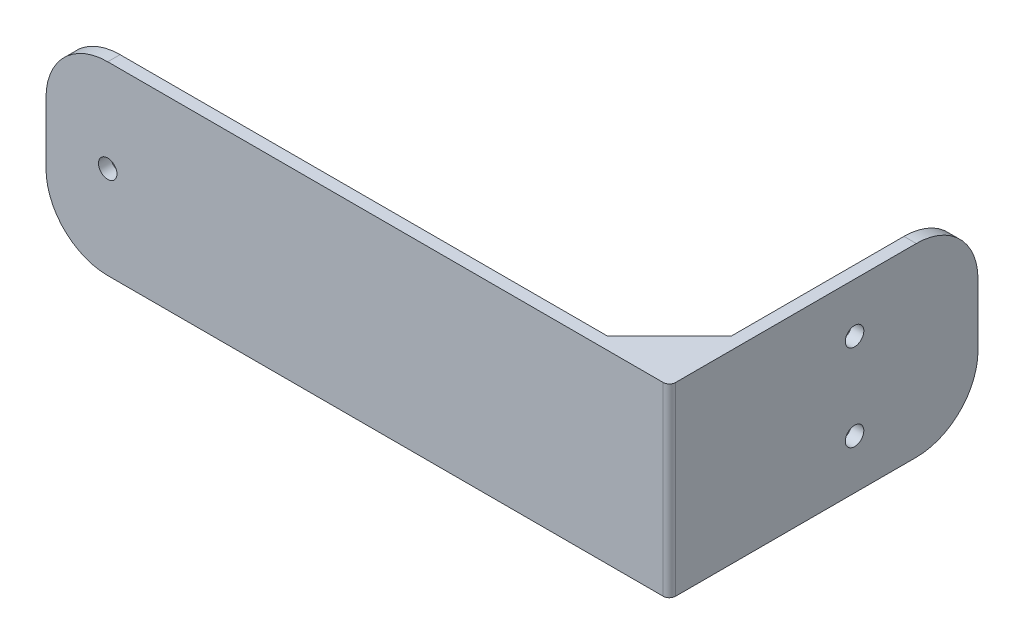
ISO-10303-21;
HEADER;
FILE_DESCRIPTION(('STEP AP214'),'2;1');
FILE_NAME('part.step','',(''),(''),'','','');
FILE_SCHEMA(('AUTOMOTIVE_DESIGN { 1 0 10303 214 1 1 1 1 }'));
ENDSEC;
DATA;
#1=APPLICATION_CONTEXT('core data for automotive mechanical design processes');
#2=APPLICATION_PROTOCOL_DEFINITION('international standard','automotive_design',2000,#1);
#3=PRODUCT_CONTEXT('',#1,'mechanical');
#4=PRODUCT('Part','Part','',(#3));
#5=PRODUCT_RELATED_PRODUCT_CATEGORY('part','',(#4));
#6=PRODUCT_DEFINITION_FORMATION('','',#4);
#7=PRODUCT_DEFINITION_CONTEXT('part definition',#1,'design');
#8=PRODUCT_DEFINITION('design','',#6,#7);
#9=PRODUCT_DEFINITION_SHAPE('','',#8);
#10=(LENGTH_UNIT() NAMED_UNIT(*) SI_UNIT(.MILLI.,.METRE.));
#11=(NAMED_UNIT(*) PLANE_ANGLE_UNIT() SI_UNIT($,.RADIAN.));
#12=(NAMED_UNIT(*) SI_UNIT($,.STERADIAN.) SOLID_ANGLE_UNIT());
#13=UNCERTAINTY_MEASURE_WITH_UNIT(LENGTH_MEASURE(1.E-05),#10,'distance_accuracy_value','');
#14=(GEOMETRIC_REPRESENTATION_CONTEXT(3) GLOBAL_UNCERTAINTY_ASSIGNED_CONTEXT((#13)) GLOBAL_UNIT_ASSIGNED_CONTEXT((#10,
#11,#12)) REPRESENTATION_CONTEXT('',''));
#15=CARTESIAN_POINT('',(0.,0.,0.));
#16=DIRECTION('',(0.,0.,1.));
#17=DIRECTION('',(1.,0.,0.));
#18=AXIS2_PLACEMENT_3D('',#15,#16,#17);
#19=CARTESIAN_POINT('',(0.,0.,0.));
#20=DIRECTION('',(0.,0.,-1.));
#21=DIRECTION('',(-1.,0.,0.));
#22=AXIS2_PLACEMENT_3D('',#19,#20,#21);
#23=PLANE('',#22);
#24=CARTESIAN_POINT('',(10.,15.,0.));
#25=DIRECTION('',(0.,0.,1.));
#26=DIRECTION('',(1.,0.,0.));
#27=AXIS2_PLACEMENT_3D('',#24,#25,#26);
#28=CIRCLE('',#27,1.5);
#29=CARTESIAN_POINT('',(11.5,15.,0.));
#30=VERTEX_POINT('',#29);
#31=EDGE_CURVE('E210',#30,#30,#28,.T.);
#32=ORIENTED_EDGE('',*,*,#31,.T.);
#33=EDGE_LOOP('',(#32));
#34=FACE_BOUND('',#33,.T.);
#35=DIRECTION('',(-1.,0.,0.));
#36=VECTOR('',#35,1.);
#37=CARTESIAN_POINT('',(0.,30.,0.));
#38=LINE('',#37,#36);
#39=CARTESIAN_POINT('',(89.,30.,0.));
#40=VERTEX_POINT('',#39);
#41=CARTESIAN_POINT('',(10.,30.,0.));
#42=VERTEX_POINT('',#41);
#43=EDGE_CURVE('E172',#40,#42,#38,.T.);
#44=ORIENTED_EDGE('',*,*,#43,.F.);
#45=DIRECTION('',(0.,1.,0.));
#46=VECTOR('',#45,1.);
#47=CARTESIAN_POINT('',(89.,28.,0.));
#48=LINE('',#47,#46);
#49=CARTESIAN_POINT('',(89.,28.,0.));
#50=VERTEX_POINT('',#49);
#51=EDGE_CURVE('E153',#50,#40,#48,.T.);
#52=ORIENTED_EDGE('',*,*,#51,.F.);
#53=DIRECTION('',(1.,0.,0.));
#54=VECTOR('',#53,1.);
#55=CARTESIAN_POINT('',(0.,28.,0.));
#56=LINE('',#55,#54);
#57=CARTESIAN_POINT('',(98.,28.,0.));
#58=VERTEX_POINT('',#57);
#59=EDGE_CURVE('E160',#50,#58,#56,.T.);
#60=ORIENTED_EDGE('',*,*,#59,.T.);
#61=DIRECTION('',(0.,1.,0.));
#62=VECTOR('',#61,1.);
#63=CARTESIAN_POINT('',(98.,0.,0.));
#64=LINE('',#63,#62);
#65=CARTESIAN_POINT('',(98.,2.,0.));
#66=VERTEX_POINT('',#65);
#67=EDGE_CURVE('E252',#58,#66,#64,.F.);
#68=ORIENTED_EDGE('',*,*,#67,.T.);
#69=DIRECTION('',(1.,0.,0.));
#70=VECTOR('',#69,1.);
#71=CARTESIAN_POINT('',(0.,2.,0.));
#72=LINE('',#71,#70);
#73=CARTESIAN_POINT('',(89.,2.,0.));
#74=VERTEX_POINT('',#73);
#75=EDGE_CURVE('E176',#74,#66,#72,.T.);
#76=ORIENTED_EDGE('',*,*,#75,.F.);
#77=DIRECTION('',(0.,-1.,0.));
#78=VECTOR('',#77,1.);
#79=CARTESIAN_POINT('',(89.,2.,0.));
#80=LINE('',#79,#78);
#81=CARTESIAN_POINT('',(89.,0.,0.));
#82=VERTEX_POINT('',#81);
#83=EDGE_CURVE('E189',#74,#82,#80,.T.);
#84=ORIENTED_EDGE('',*,*,#83,.T.);
#85=DIRECTION('',(1.,0.,0.));
#86=VECTOR('',#85,1.);
#87=CARTESIAN_POINT('',(0.,0.,0.));
#88=LINE('',#87,#86);
#89=CARTESIAN_POINT('',(10.,0.,0.));
#90=VERTEX_POINT('',#89);
#91=EDGE_CURVE('E235',#90,#82,#88,.T.);
#92=ORIENTED_EDGE('',*,*,#91,.F.);
#93=CARTESIAN_POINT('',(10.,10.,0.));
#94=DIRECTION('',(0.,0.,-1.));
#95=DIRECTION('',(-1.,0.,0.));
#96=AXIS2_PLACEMENT_3D('',#93,#94,#95);
#97=CIRCLE('',#96,10.);
#98=CARTESIAN_POINT('',(0.,10.,0.));
#99=VERTEX_POINT('',#98);
#100=EDGE_CURVE('E263',#90,#99,#97,.T.);
#101=ORIENTED_EDGE('',*,*,#100,.T.);
#102=DIRECTION('',(0.,-1.,0.));
#103=VECTOR('',#102,1.);
#104=CARTESIAN_POINT('',(0.,0.,0.));
#105=LINE('',#104,#103);
#106=CARTESIAN_POINT('',(0.,20.,0.));
#107=VERTEX_POINT('',#106);
#108=EDGE_CURVE('E221',#107,#99,#105,.T.);
#109=ORIENTED_EDGE('',*,*,#108,.F.);
#110=CARTESIAN_POINT('',(10.,20.,0.));
#111=DIRECTION('',(0.,0.,-1.));
#112=DIRECTION('',(-1.,0.,0.));
#113=AXIS2_PLACEMENT_3D('',#110,#111,#112);
#114=CIRCLE('',#113,10.);
#115=EDGE_CURVE('E265',#107,#42,#114,.T.);
#116=ORIENTED_EDGE('',*,*,#115,.T.);
#117=EDGE_LOOP('',(#44,#52,#60,#68,#76,#84,#92,#101,#109,#116));
#118=FACE_BOUND('',#117,.T.);
#119=ADVANCED_FACE('F37',(#34,#118),#23,.T.);
#120=CARTESIAN_POINT('',(99.,0.,-48.));
#121=DIRECTION('',(-1.,0.,0.));
#122=DIRECTION('',(0.,0.,1.));
#123=AXIS2_PLACEMENT_3D('',#120,#121,#122);
#124=PLANE('',#123);
#125=CARTESIAN_POINT('',(99.,22.,-28.));
#126=DIRECTION('',(-1.,0.,0.));
#127=DIRECTION('',(0.,0.,1.));
#128=AXIS2_PLACEMENT_3D('',#125,#126,#127);
#129=CIRCLE('',#128,1.5);
#130=CARTESIAN_POINT('',(99.,22.,-26.5));
#131=VERTEX_POINT('',#130);
#132=EDGE_CURVE('E205',#131,#131,#129,.T.);
#133=ORIENTED_EDGE('',*,*,#132,.F.);
#134=EDGE_LOOP('',(#133));
#135=FACE_BOUND('',#134,.T.);
#136=CARTESIAN_POINT('',(99.,7.99999999999998,-28.));
#137=DIRECTION('',(-1.,0.,0.));
#138=DIRECTION('',(0.,0.,1.));
#139=AXIS2_PLACEMENT_3D('',#136,#137,#138);
#140=CIRCLE('',#139,1.5);
#141=CARTESIAN_POINT('',(99.,7.99999999999998,-26.5));
#142=VERTEX_POINT('',#141);
#143=EDGE_CURVE('E199',#142,#142,#140,.T.);
#144=ORIENTED_EDGE('',*,*,#143,.F.);
#145=EDGE_LOOP('',(#144));
#146=FACE_BOUND('',#145,.T.);
#147=DIRECTION('',(0.,0.,-1.));
#148=VECTOR('',#147,1.);
#149=CARTESIAN_POINT('',(99.,28.,0.));
#150=LINE('',#149,#148);
#151=CARTESIAN_POINT('',(99.,28.,-1.));
#152=VERTEX_POINT('',#151);
#153=CARTESIAN_POINT('',(99.,28.,-10.));
#154=VERTEX_POINT('',#153);
#155=EDGE_CURVE('E159',#152,#154,#150,.T.);
#156=ORIENTED_EDGE('',*,*,#155,.T.);
#157=DIRECTION('',(0.,1.,0.));
#158=VECTOR('',#157,1.);
#159=CARTESIAN_POINT('',(99.,28.,-10.));
#160=LINE('',#159,#158);
#161=CARTESIAN_POINT('',(99.,30.,-10.));
#162=VERTEX_POINT('',#161);
#163=EDGE_CURVE('E156',#154,#162,#160,.T.);
#164=ORIENTED_EDGE('',*,*,#163,.T.);
#165=DIRECTION('',(0.,0.,1.));
#166=VECTOR('',#165,1.);
#167=CARTESIAN_POINT('',(99.,30.,-48.));
#168=LINE('',#167,#166);
#169=CARTESIAN_POINT('',(99.,30.,-38.));
#170=VERTEX_POINT('',#169);
#171=EDGE_CURVE('E214',#170,#162,#168,.T.);
#172=ORIENTED_EDGE('',*,*,#171,.F.);
#173=CARTESIAN_POINT('',(99.,20.,-38.));
#174=DIRECTION('',(-1.,0.,0.));
#175=DIRECTION('',(0.,0.,1.));
#176=AXIS2_PLACEMENT_3D('',#173,#174,#175);
#177=CIRCLE('',#176,10.);
#178=CARTESIAN_POINT('',(99.,20.,-48.));
#179=VERTEX_POINT('',#178);
#180=EDGE_CURVE('E45',#170,#179,#177,.T.);
#181=ORIENTED_EDGE('',*,*,#180,.T.);
#182=DIRECTION('',(0.,-1.,0.));
#183=VECTOR('',#182,1.);
#184=CARTESIAN_POINT('',(99.,0.,-48.));
#185=LINE('',#184,#183);
#186=CARTESIAN_POINT('',(99.,10.,-48.));
#187=VERTEX_POINT('',#186);
#188=EDGE_CURVE('E204',#179,#187,#185,.T.);
#189=ORIENTED_EDGE('',*,*,#188,.T.);
#190=CARTESIAN_POINT('',(99.,10.,-38.));
#191=DIRECTION('',(-1.,0.,0.));
#192=DIRECTION('',(0.,0.,1.));
#193=AXIS2_PLACEMENT_3D('',#190,#191,#192);
#194=CIRCLE('',#193,10.);
#195=CARTESIAN_POINT('',(99.,0.,-38.));
#196=VERTEX_POINT('',#195);
#197=EDGE_CURVE('E11',#187,#196,#194,.T.);
#198=ORIENTED_EDGE('',*,*,#197,.T.);
#199=DIRECTION('',(0.,0.,1.));
#200=VECTOR('',#199,1.);
#201=CARTESIAN_POINT('',(99.,0.,-48.));
#202=LINE('',#201,#200);
#203=CARTESIAN_POINT('',(99.,0.,-10.));
#204=VERTEX_POINT('',#203);
#205=EDGE_CURVE('E211',#196,#204,#202,.T.);
#206=ORIENTED_EDGE('',*,*,#205,.T.);
#207=DIRECTION('',(0.,-1.,0.));
#208=VECTOR('',#207,1.);
#209=CARTESIAN_POINT('',(99.,2.,-10.));
#210=LINE('',#209,#208);
#211=CARTESIAN_POINT('',(99.,2.,-10.));
#212=VERTEX_POINT('',#211);
#213=EDGE_CURVE('E193',#212,#204,#210,.T.);
#214=ORIENTED_EDGE('',*,*,#213,.F.);
#215=DIRECTION('',(0.,0.,-1.));
#216=VECTOR('',#215,1.);
#217=CARTESIAN_POINT('',(99.,2.,0.));
#218=LINE('',#217,#216);
#219=CARTESIAN_POINT('',(99.,2.,-1.));
#220=VERTEX_POINT('',#219);
#221=EDGE_CURVE('E185',#220,#212,#218,.T.);
#222=ORIENTED_EDGE('',*,*,#221,.F.);
#223=DIRECTION('',(0.,1.,0.));
#224=VECTOR('',#223,1.);
#225=CARTESIAN_POINT('',(99.,30.,-1.));
#226=LINE('',#225,#224);
#227=EDGE_CURVE('E249',#220,#152,#226,.T.);
#228=ORIENTED_EDGE('',*,*,#227,.T.);
#229=EDGE_LOOP('',(#156,#164,#172,#181,#189,#198,#206,#214,#222,#228));
#230=FACE_BOUND('',#229,.T.);
#231=ADVANCED_FACE('F305',(#135,#146,#230),#124,.T.);
#232=CARTESIAN_POINT('',(0.,0.,2.));
#233=DIRECTION('',(0.,0.,-1.));
#234=DIRECTION('',(-1.,0.,0.));
#235=AXIS2_PLACEMENT_3D('',#232,#233,#234);
#236=PLANE('',#235);
#237=DIRECTION('',(-1.,0.,0.));
#238=VECTOR('',#237,1.);
#239=CARTESIAN_POINT('',(0.,30.,2.));
#240=LINE('',#239,#238);
#241=CARTESIAN_POINT('',(100.,30.,2.));
#242=VERTEX_POINT('',#241);
#243=CARTESIAN_POINT('',(10.,30.,2.));
#244=VERTEX_POINT('',#243);
#245=EDGE_CURVE('E229',#242,#244,#240,.T.);
#246=ORIENTED_EDGE('',*,*,#245,.T.);
#247=CARTESIAN_POINT('',(10.,20.,2.));
#248=DIRECTION('',(0.,0.,-1.));
#249=DIRECTION('',(-1.,0.,0.));
#250=AXIS2_PLACEMENT_3D('',#247,#248,#249);
#251=CIRCLE('',#250,10.);
#252=CARTESIAN_POINT('',(0.,20.,2.));
#253=VERTEX_POINT('',#252);
#254=EDGE_CURVE('E273',#244,#253,#251,.F.);
#255=ORIENTED_EDGE('',*,*,#254,.T.);
#256=DIRECTION('',(0.,-1.,0.));
#257=VECTOR('',#256,1.);
#258=CARTESIAN_POINT('',(0.,0.,2.));
#259=LINE('',#258,#257);
#260=CARTESIAN_POINT('',(0.,10.,2.));
#261=VERTEX_POINT('',#260);
#262=EDGE_CURVE('E224',#253,#261,#259,.T.);
#263=ORIENTED_EDGE('',*,*,#262,.T.);
#264=CARTESIAN_POINT('',(10.,10.,2.));
#265=DIRECTION('',(0.,0.,-1.));
#266=DIRECTION('',(-1.,0.,0.));
#267=AXIS2_PLACEMENT_3D('',#264,#265,#266);
#268=CIRCLE('',#267,10.);
#269=CARTESIAN_POINT('',(10.,0.,2.));
#270=VERTEX_POINT('',#269);
#271=EDGE_CURVE('E271',#261,#270,#268,.F.);
#272=ORIENTED_EDGE('',*,*,#271,.T.);
#273=DIRECTION('',(1.,0.,0.));
#274=VECTOR('',#273,1.);
#275=CARTESIAN_POINT('',(0.,0.,2.));
#276=LINE('',#275,#274);
#277=CARTESIAN_POINT('',(100.,0.,2.));
#278=VERTEX_POINT('',#277);
#279=EDGE_CURVE('E227',#270,#278,#276,.T.);
#280=ORIENTED_EDGE('',*,*,#279,.T.);
#281=DIRECTION('',(0.,-1.,0.));
#282=VECTOR('',#281,1.);
#283=CARTESIAN_POINT('',(100.,0.,2.));
#284=LINE('',#283,#282);
#285=EDGE_CURVE('E244',#278,#242,#284,.F.);
#286=ORIENTED_EDGE('',*,*,#285,.T.);
#287=EDGE_LOOP('',(#246,#255,#263,#272,#280,#286));
#288=FACE_BOUND('',#287,.T.);
#289=CARTESIAN_POINT('',(10.,15.,2.));
#290=DIRECTION('',(0.,0.,1.));
#291=DIRECTION('',(1.,0.,0.));
#292=AXIS2_PLACEMENT_3D('',#289,#290,#291);
#293=CIRCLE('',#292,1.5);
#294=CARTESIAN_POINT('',(11.5,15.,2.));
#295=VERTEX_POINT('',#294);
#296=EDGE_CURVE('E218',#295,#295,#293,.T.);
#297=ORIENTED_EDGE('',*,*,#296,.F.);
#298=EDGE_LOOP('',(#297));
#299=FACE_BOUND('',#298,.T.);
#300=ADVANCED_FACE('F336',(#288,#299),#236,.F.);
#301=CARTESIAN_POINT('',(0.,0.,2.));
#302=DIRECTION('',(1.,0.,0.));
#303=DIRECTION('',(0.,0.,-1.));
#304=AXIS2_PLACEMENT_3D('',#301,#302,#303);
#305=PLANE('',#304);
#306=ORIENTED_EDGE('',*,*,#262,.F.);
#307=DIRECTION('',(0.,0.,-1.));
#308=VECTOR('',#307,1.);
#309=CARTESIAN_POINT('',(0.,20.,2.));
#310=LINE('',#309,#308);
#311=EDGE_CURVE('E260',#253,#107,#310,.T.);
#312=ORIENTED_EDGE('',*,*,#311,.T.);
#313=ORIENTED_EDGE('',*,*,#108,.T.);
#314=DIRECTION('',(0.,0.,-1.));
#315=VECTOR('',#314,1.);
#316=CARTESIAN_POINT('',(0.,10.,2.));
#317=LINE('',#316,#315);
#318=EDGE_CURVE('E254',#99,#261,#317,.F.);
#319=ORIENTED_EDGE('',*,*,#318,.T.);
#320=EDGE_LOOP('',(#306,#312,#313,#319));
#321=FACE_BOUND('',#320,.T.);
#322=ADVANCED_FACE('F347',(#321),#305,.F.);
#323=CARTESIAN_POINT('',(0.,0.,2.));
#324=DIRECTION('',(0.,1.,0.));
#325=DIRECTION('',(0.,0.,1.));
#326=AXIS2_PLACEMENT_3D('',#323,#324,#325);
#327=PLANE('',#326);
#328=DIRECTION('',(0.707106781186547,0.,-0.707106781186548));
#329=VECTOR('',#328,1.);
#330=CARTESIAN_POINT('',(44.5,0.,44.5));
#331=LINE('',#330,#329);
#332=EDGE_CURVE('E173',#82,#204,#331,.T.);
#333=ORIENTED_EDGE('',*,*,#332,.T.);
#334=ORIENTED_EDGE('',*,*,#205,.F.);
#335=DIRECTION('',(1.,0.,0.));
#336=VECTOR('',#335,1.);
#337=CARTESIAN_POINT('',(0.,0.,-38.));
#338=LINE('',#337,#336);
#339=CARTESIAN_POINT('',(101.,0.,-38.));
#340=VERTEX_POINT('',#339);
#341=EDGE_CURVE('E275',#196,#340,#338,.T.);
#342=ORIENTED_EDGE('',*,*,#341,.T.);
#343=DIRECTION('',(0.,0.,1.));
#344=VECTOR('',#343,1.);
#345=CARTESIAN_POINT('',(101.,0.,-48.));
#346=LINE('',#345,#344);
#347=CARTESIAN_POINT('',(101.,0.,1.));
#348=VERTEX_POINT('',#347);
#349=EDGE_CURVE('E208',#340,#348,#346,.T.);
#350=ORIENTED_EDGE('',*,*,#349,.T.);
#351=CARTESIAN_POINT('',(100.,0.,1.));
#352=DIRECTION('',(0.,1.,0.));
#353=DIRECTION('',(0.,0.,1.));
#354=AXIS2_PLACEMENT_3D('',#351,#352,#353);
#355=CIRCLE('',#354,1.);
#356=EDGE_CURVE('E241',#348,#278,#355,.F.);
#357=ORIENTED_EDGE('',*,*,#356,.T.);
#358=ORIENTED_EDGE('',*,*,#279,.F.);
#359=DIRECTION('',(0.,0.,-1.));
#360=VECTOR('',#359,1.);
#361=CARTESIAN_POINT('',(10.,0.,2.));
#362=LINE('',#361,#360);
#363=EDGE_CURVE('E278',#270,#90,#362,.T.);
#364=ORIENTED_EDGE('',*,*,#363,.T.);
#365=ORIENTED_EDGE('',*,*,#91,.T.);
#366=EDGE_LOOP('',(#333,#334,#342,#350,#357,#358,#364,#365));
#367=FACE_BOUND('',#366,.T.);
#368=ADVANCED_FACE('F302',(#367),#327,.F.);
#369=CARTESIAN_POINT('',(0.,30.,2.));
#370=DIRECTION('',(0.,-1.,0.));
#371=DIRECTION('',(0.,0.,-1.));
#372=AXIS2_PLACEMENT_3D('',#369,#370,#371);
#373=PLANE('',#372);
#374=DIRECTION('',(0.707106781186547,0.,-0.707106781186548));
#375=VECTOR('',#374,1.);
#376=CARTESIAN_POINT('',(44.5,30.,44.5));
#377=LINE('',#376,#375);
#378=EDGE_CURVE('E168',#40,#162,#377,.T.);
#379=ORIENTED_EDGE('',*,*,#378,.F.);
#380=ORIENTED_EDGE('',*,*,#43,.T.);
#381=DIRECTION('',(0.,0.,-1.));
#382=VECTOR('',#381,1.);
#383=CARTESIAN_POINT('',(10.,30.,2.));
#384=LINE('',#383,#382);
#385=EDGE_CURVE('E269',#42,#244,#384,.F.);
#386=ORIENTED_EDGE('',*,*,#385,.T.);
#387=ORIENTED_EDGE('',*,*,#245,.F.);
#388=CARTESIAN_POINT('',(100.,30.,1.));
#389=DIRECTION('',(0.,-1.,0.));
#390=DIRECTION('',(0.,0.,-1.));
#391=AXIS2_PLACEMENT_3D('',#388,#389,#390);
#392=CIRCLE('',#391,1.);
#393=CARTESIAN_POINT('',(101.,30.,1.));
#394=VERTEX_POINT('',#393);
#395=EDGE_CURVE('E246',#242,#394,#392,.F.);
#396=ORIENTED_EDGE('',*,*,#395,.T.);
#397=DIRECTION('',(0.,0.,1.));
#398=VECTOR('',#397,1.);
#399=CARTESIAN_POINT('',(101.,30.,-48.));
#400=LINE('',#399,#398);
#401=CARTESIAN_POINT('',(101.,30.,-38.));
#402=VERTEX_POINT('',#401);
#403=EDGE_CURVE('E207',#402,#394,#400,.T.);
#404=ORIENTED_EDGE('',*,*,#403,.F.);
#405=DIRECTION('',(1.,0.,0.));
#406=VECTOR('',#405,1.);
#407=CARTESIAN_POINT('',(0.,30.,-38.));
#408=LINE('',#407,#406);
#409=EDGE_CURVE('E267',#402,#170,#408,.F.);
#410=ORIENTED_EDGE('',*,*,#409,.T.);
#411=ORIENTED_EDGE('',*,*,#171,.T.);
#412=EDGE_LOOP('',(#379,#380,#386,#387,#396,#404,#410,#411));
#413=FACE_BOUND('',#412,.T.);
#414=ADVANCED_FACE('F321',(#413),#373,.F.);
#415=CARTESIAN_POINT('',(10.,15.,2.));
#416=DIRECTION('',(0.,0.,-1.));
#417=DIRECTION('',(-1.,0.,0.));
#418=AXIS2_PLACEMENT_3D('',#415,#416,#417);
#419=CYLINDRICAL_SURFACE('',#418,1.5);
#420=ORIENTED_EDGE('',*,*,#296,.T.);
#421=EDGE_LOOP('',(#420));
#422=FACE_BOUND('',#421,.T.);
#423=ORIENTED_EDGE('',*,*,#31,.F.);
#424=EDGE_LOOP('',(#423));
#425=FACE_BOUND('',#424,.T.);
#426=ADVANCED_FACE('F344',(#422,#425),#419,.F.);
#427=CARTESIAN_POINT('',(101.,0.,-48.));
#428=DIRECTION('',(-1.,0.,0.));
#429=DIRECTION('',(0.,0.,1.));
#430=AXIS2_PLACEMENT_3D('',#427,#428,#429);
#431=PLANE('',#430);
#432=CARTESIAN_POINT('',(101.,22.,-28.));
#433=DIRECTION('',(1.,0.,0.));
#434=DIRECTION('',(0.,1.,0.));
#435=AXIS2_PLACEMENT_3D('',#432,#433,#434);
#436=CIRCLE('',#435,1.5);
#437=CARTESIAN_POINT('',(101.,23.5,-28.));
#438=VERTEX_POINT('',#437);
#439=EDGE_CURVE('E196',#438,#438,#436,.T.);
#440=ORIENTED_EDGE('',*,*,#439,.F.);
#441=EDGE_LOOP('',(#440));
#442=FACE_BOUND('',#441,.T.);
#443=CARTESIAN_POINT('',(101.,7.99999999999998,-28.));
#444=DIRECTION('',(1.,0.,0.));
#445=DIRECTION('',(0.,1.,0.));
#446=AXIS2_PLACEMENT_3D('',#443,#444,#445);
#447=CIRCLE('',#446,1.5);
#448=CARTESIAN_POINT('',(101.,9.49999999999998,-28.));
#449=VERTEX_POINT('',#448);
#450=EDGE_CURVE('E195',#449,#449,#447,.T.);
#451=ORIENTED_EDGE('',*,*,#450,.F.);
#452=EDGE_LOOP('',(#451));
#453=FACE_BOUND('',#452,.T.);
#454=ORIENTED_EDGE('',*,*,#349,.F.);
#455=CARTESIAN_POINT('',(101.,10.,-38.));
#456=DIRECTION('',(-1.,0.,0.));
#457=DIRECTION('',(0.,0.,1.));
#458=AXIS2_PLACEMENT_3D('',#455,#456,#457);
#459=CIRCLE('',#458,10.);
#460=CARTESIAN_POINT('',(101.,10.,-48.));
#461=VERTEX_POINT('',#460);
#462=EDGE_CURVE('E283',#340,#461,#459,.F.);
#463=ORIENTED_EDGE('',*,*,#462,.T.);
#464=DIRECTION('',(0.,-1.,0.));
#465=VECTOR('',#464,1.);
#466=CARTESIAN_POINT('',(101.,0.,-48.));
#467=LINE('',#466,#465);
#468=CARTESIAN_POINT('',(101.,20.,-48.));
#469=VERTEX_POINT('',#468);
#470=EDGE_CURVE('E202',#469,#461,#467,.T.);
#471=ORIENTED_EDGE('',*,*,#470,.F.);
#472=CARTESIAN_POINT('',(101.,20.,-38.));
#473=DIRECTION('',(-1.,0.,0.));
#474=DIRECTION('',(0.,0.,1.));
#475=AXIS2_PLACEMENT_3D('',#472,#473,#474);
#476=CIRCLE('',#475,10.);
#477=EDGE_CURVE('E281',#469,#402,#476,.F.);
#478=ORIENTED_EDGE('',*,*,#477,.T.);
#479=ORIENTED_EDGE('',*,*,#403,.T.);
#480=DIRECTION('',(0.,-1.,0.));
#481=VECTOR('',#480,1.);
#482=CARTESIAN_POINT('',(101.,0.,1.));
#483=LINE('',#482,#481);
#484=EDGE_CURVE('E232',#394,#348,#483,.T.);
#485=ORIENTED_EDGE('',*,*,#484,.T.);
#486=EDGE_LOOP('',(#454,#463,#471,#478,#479,#485));
#487=FACE_BOUND('',#486,.T.);
#488=ADVANCED_FACE('F294',(#442,#453,#487),#431,.F.);
#489=CARTESIAN_POINT('',(0.,0.,-48.));
#490=DIRECTION('',(0.,0.,1.));
#491=DIRECTION('',(1.,0.,0.));
#492=AXIS2_PLACEMENT_3D('',#489,#490,#491);
#493=PLANE('',#492);
#494=ORIENTED_EDGE('',*,*,#470,.T.);
#495=DIRECTION('',(1.,0.,0.));
#496=VECTOR('',#495,1.);
#497=CARTESIAN_POINT('',(0.,10.,-48.));
#498=LINE('',#497,#496);
#499=EDGE_CURVE('E52',#461,#187,#498,.F.);
#500=ORIENTED_EDGE('',*,*,#499,.T.);
#501=ORIENTED_EDGE('',*,*,#188,.F.);
#502=DIRECTION('',(1.,0.,0.));
#503=VECTOR('',#502,1.);
#504=CARTESIAN_POINT('',(0.,20.,-48.));
#505=LINE('',#504,#503);
#506=EDGE_CURVE('E285',#179,#469,#505,.T.);
#507=ORIENTED_EDGE('',*,*,#506,.T.);
#508=EDGE_LOOP('',(#494,#500,#501,#507));
#509=FACE_BOUND('',#508,.T.);
#510=ADVANCED_FACE('F290',(#509),#493,.F.);
#511=CARTESIAN_POINT('',(100.,0.,1.));
#512=DIRECTION('',(0.,-1.,0.));
#513=DIRECTION('',(0.,0.,-1.));
#514=AXIS2_PLACEMENT_3D('',#511,#512,#513);
#515=CYLINDRICAL_SURFACE('',#514,1.);
#516=ORIENTED_EDGE('',*,*,#395,.F.);
#517=ORIENTED_EDGE('',*,*,#285,.F.);
#518=ORIENTED_EDGE('',*,*,#356,.F.);
#519=ORIENTED_EDGE('',*,*,#484,.F.);
#520=EDGE_LOOP('',(#516,#517,#518,#519));
#521=FACE_BOUND('',#520,.T.);
#522=ADVANCED_FACE('F351',(#521),#515,.T.);
#523=CARTESIAN_POINT('',(98.,0.,-1.));
#524=DIRECTION('',(0.,-1.,0.));
#525=DIRECTION('',(0.,0.,-1.));
#526=AXIS2_PLACEMENT_3D('',#523,#524,#525);
#527=CYLINDRICAL_SURFACE('',#526,1.);
#528=ORIENTED_EDGE('',*,*,#67,.F.);
#529=CARTESIAN_POINT('',(98.,28.,-1.));
#530=DIRECTION('',(0.,1.,0.));
#531=DIRECTION('',(0.,0.,1.));
#532=AXIS2_PLACEMENT_3D('',#529,#530,#531);
#533=CIRCLE('',#532,0.999999999999998);
#534=EDGE_CURVE('E165',#58,#152,#533,.T.);
#535=ORIENTED_EDGE('',*,*,#534,.T.);
#536=ORIENTED_EDGE('',*,*,#227,.F.);
#537=CARTESIAN_POINT('',(98.,2.,-1.));
#538=DIRECTION('',(0.,1.,0.));
#539=DIRECTION('',(0.,0.,1.));
#540=AXIS2_PLACEMENT_3D('',#537,#538,#539);
#541=CIRCLE('',#540,0.999999999999998);
#542=EDGE_CURVE('E183',#66,#220,#541,.T.);
#543=ORIENTED_EDGE('',*,*,#542,.F.);
#544=EDGE_LOOP('',(#528,#535,#536,#543));
#545=FACE_BOUND('',#544,.T.);
#546=ADVANCED_FACE('F317',(#545),#527,.F.);
#547=CARTESIAN_POINT('',(91.,7.99999999999998,-28.));
#548=DIRECTION('',(1.,0.,0.));
#549=DIRECTION('',(0.,1.,0.));
#550=AXIS2_PLACEMENT_3D('',#547,#548,#549);
#551=CYLINDRICAL_SURFACE('',#550,1.5);
#552=ORIENTED_EDGE('',*,*,#143,.T.);
#553=EDGE_LOOP('',(#552));
#554=FACE_BOUND('',#553,.T.);
#555=ORIENTED_EDGE('',*,*,#450,.T.);
#556=EDGE_LOOP('',(#555));
#557=FACE_BOUND('',#556,.T.);
#558=ADVANCED_FACE('F357',(#554,#557),#551,.F.);
#559=CARTESIAN_POINT('',(91.,22.,-28.));
#560=DIRECTION('',(1.,0.,0.));
#561=DIRECTION('',(0.,1.,0.));
#562=AXIS2_PLACEMENT_3D('',#559,#560,#561);
#563=CYLINDRICAL_SURFACE('',#562,1.5);
#564=ORIENTED_EDGE('',*,*,#132,.T.);
#565=EDGE_LOOP('',(#564));
#566=FACE_BOUND('',#565,.T.);
#567=ORIENTED_EDGE('',*,*,#439,.T.);
#568=EDGE_LOOP('',(#567));
#569=FACE_BOUND('',#568,.T.);
#570=ADVANCED_FACE('F361',(#566,#569),#563,.F.);
#571=CARTESIAN_POINT('',(10.,20.,2.));
#572=DIRECTION('',(0.,0.,-1.));
#573=DIRECTION('',(-1.,0.,0.));
#574=AXIS2_PLACEMENT_3D('',#571,#572,#573);
#575=CYLINDRICAL_SURFACE('',#574,10.);
#576=ORIENTED_EDGE('',*,*,#254,.F.);
#577=ORIENTED_EDGE('',*,*,#385,.F.);
#578=ORIENTED_EDGE('',*,*,#115,.F.);
#579=ORIENTED_EDGE('',*,*,#311,.F.);
#580=EDGE_LOOP('',(#576,#577,#578,#579));
#581=FACE_BOUND('',#580,.T.);
#582=ADVANCED_FACE('F358',(#581),#575,.T.);
#583=CARTESIAN_POINT('',(10.,10.,2.));
#584=DIRECTION('',(0.,0.,-1.));
#585=DIRECTION('',(-1.,0.,0.));
#586=AXIS2_PLACEMENT_3D('',#583,#584,#585);
#587=CYLINDRICAL_SURFACE('',#586,10.);
#588=ORIENTED_EDGE('',*,*,#271,.F.);
#589=ORIENTED_EDGE('',*,*,#318,.F.);
#590=ORIENTED_EDGE('',*,*,#100,.F.);
#591=ORIENTED_EDGE('',*,*,#363,.F.);
#592=EDGE_LOOP('',(#588,#589,#590,#591));
#593=FACE_BOUND('',#592,.T.);
#594=ADVANCED_FACE('F329',(#593),#587,.T.);
#595=CARTESIAN_POINT('',(0.,10.,-38.));
#596=DIRECTION('',(1.,0.,0.));
#597=DIRECTION('',(0.,0.,-1.));
#598=AXIS2_PLACEMENT_3D('',#595,#596,#597);
#599=CYLINDRICAL_SURFACE('',#598,10.);
#600=ORIENTED_EDGE('',*,*,#197,.F.);
#601=ORIENTED_EDGE('',*,*,#499,.F.);
#602=ORIENTED_EDGE('',*,*,#462,.F.);
#603=ORIENTED_EDGE('',*,*,#341,.F.);
#604=EDGE_LOOP('',(#600,#601,#602,#603));
#605=FACE_BOUND('',#604,.T.);
#606=ADVANCED_FACE('F299',(#605),#599,.T.);
#607=CARTESIAN_POINT('',(0.,20.,-38.));
#608=DIRECTION('',(1.,0.,0.));
#609=DIRECTION('',(0.,0.,-1.));
#610=AXIS2_PLACEMENT_3D('',#607,#608,#609);
#611=CYLINDRICAL_SURFACE('',#610,10.);
#612=ORIENTED_EDGE('',*,*,#180,.F.);
#613=ORIENTED_EDGE('',*,*,#409,.F.);
#614=ORIENTED_EDGE('',*,*,#477,.F.);
#615=ORIENTED_EDGE('',*,*,#506,.F.);
#616=EDGE_LOOP('',(#612,#613,#614,#615));
#617=FACE_BOUND('',#616,.T.);
#618=ADVANCED_FACE('F39',(#617),#611,.T.);
#619=CARTESIAN_POINT('',(44.5,2.,44.5));
#620=DIRECTION('',(-0.707106781186548,0.,-0.707106781186547));
#621=DIRECTION('',(-0.707106781186547,0.,0.707106781186548));
#622=AXIS2_PLACEMENT_3D('',#619,#620,#621);
#623=PLANE('',#622);
#624=ORIENTED_EDGE('',*,*,#332,.F.);
#625=ORIENTED_EDGE('',*,*,#83,.F.);
#626=DIRECTION('',(0.707106781186547,0.,-0.707106781186548));
#627=VECTOR('',#626,1.);
#628=CARTESIAN_POINT('',(44.5,2.,44.5));
#629=LINE('',#628,#627);
#630=EDGE_CURVE('E187',#74,#212,#629,.T.);
#631=ORIENTED_EDGE('',*,*,#630,.T.);
#632=ORIENTED_EDGE('',*,*,#213,.T.);
#633=EDGE_LOOP('',(#624,#625,#631,#632));
#634=FACE_BOUND('',#633,.T.);
#635=ADVANCED_FACE('F309',(#634),#623,.T.);
#636=CARTESIAN_POINT('',(0.,2.,0.));
#637=DIRECTION('',(0.,1.,0.));
#638=DIRECTION('',(0.,0.,1.));
#639=AXIS2_PLACEMENT_3D('',#636,#637,#638);
#640=PLANE('',#639);
#641=ORIENTED_EDGE('',*,*,#75,.T.);
#642=ORIENTED_EDGE('',*,*,#542,.T.);
#643=ORIENTED_EDGE('',*,*,#221,.T.);
#644=ORIENTED_EDGE('',*,*,#630,.F.);
#645=EDGE_LOOP('',(#641,#642,#643,#644));
#646=FACE_BOUND('',#645,.T.);
#647=ADVANCED_FACE('F313',(#646),#640,.T.);
#648=CARTESIAN_POINT('',(44.5,28.,44.5));
#649=DIRECTION('',(0.707106781186548,0.,0.707106781186547));
#650=DIRECTION('',(0.707106781186547,0.,-0.707106781186548));
#651=AXIS2_PLACEMENT_3D('',#648,#649,#650);
#652=PLANE('',#651);
#653=ORIENTED_EDGE('',*,*,#378,.T.);
#654=ORIENTED_EDGE('',*,*,#163,.F.);
#655=DIRECTION('',(0.707106781186547,0.,-0.707106781186548));
#656=VECTOR('',#655,1.);
#657=CARTESIAN_POINT('',(44.5,28.,44.5));
#658=LINE('',#657,#656);
#659=EDGE_CURVE('E149',#50,#154,#658,.T.);
#660=ORIENTED_EDGE('',*,*,#659,.F.);
#661=ORIENTED_EDGE('',*,*,#51,.T.);
#662=EDGE_LOOP('',(#653,#654,#660,#661));
#663=FACE_BOUND('',#662,.T.);
#664=ADVANCED_FACE('F151',(#663),#652,.F.);
#665=CARTESIAN_POINT('',(0.,28.,0.));
#666=DIRECTION('',(0.,-1.,0.));
#667=DIRECTION('',(0.,0.,1.));
#668=AXIS2_PLACEMENT_3D('',#665,#666,#667);
#669=PLANE('',#668);
#670=ORIENTED_EDGE('',*,*,#59,.F.);
#671=ORIENTED_EDGE('',*,*,#659,.T.);
#672=ORIENTED_EDGE('',*,*,#155,.F.);
#673=ORIENTED_EDGE('',*,*,#534,.F.);
#674=EDGE_LOOP('',(#670,#671,#672,#673));
#675=FACE_BOUND('',#674,.T.);
#676=ADVANCED_FACE('F163',(#675),#669,.T.);
#677=CLOSED_SHELL('',(#119,#231,#300,#322,#368,#414,#426,#488,#510,#522,#546,#558,#570,#582,
#594,#606,#618,#635,#647,#664,#676));
#678=MANIFOLD_SOLID_BREP('B2',#677);
#679=ADVANCED_BREP_SHAPE_REPRESENTATION('',(#18,#678),#14);
#680=SHAPE_DEFINITION_REPRESENTATION(#9,#679);
ENDSEC;
END-ISO-10303-21;
